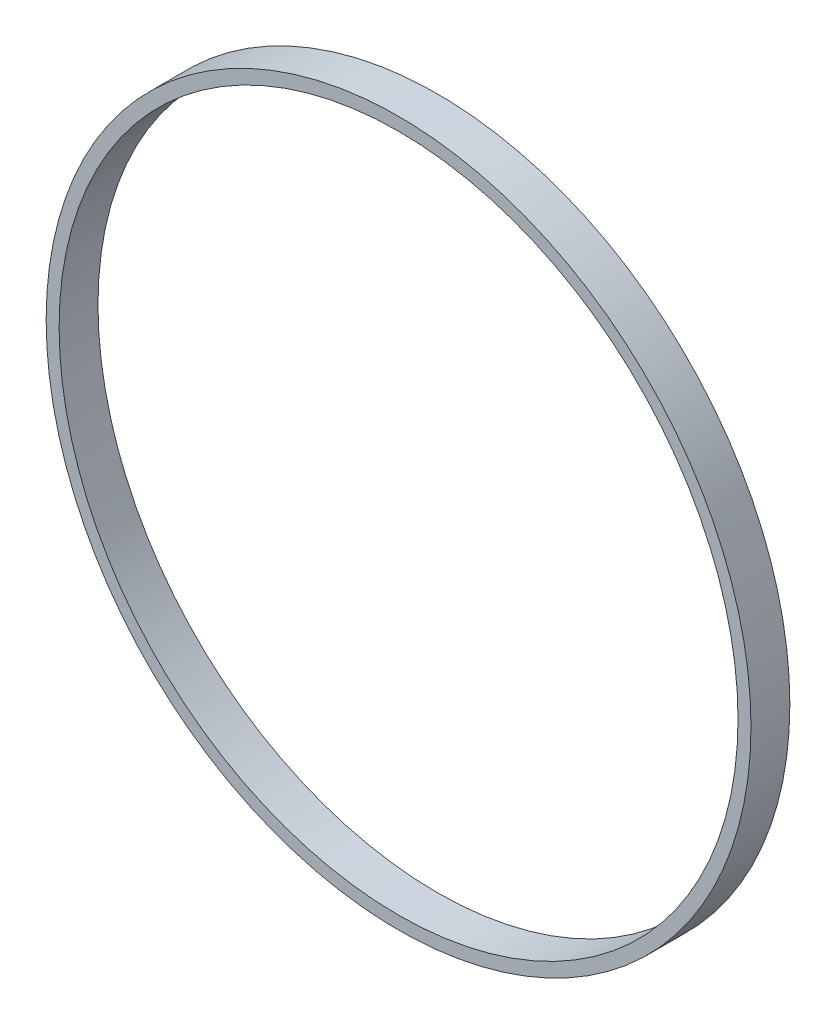
ISO-10303-21;
HEADER;
FILE_DESCRIPTION(('STEP AP214'),'2;1');
FILE_NAME('part.step','',(''),(''),'','','');
FILE_SCHEMA(('AUTOMOTIVE_DESIGN { 1 0 10303 214 1 1 1 1 }'));
ENDSEC;
DATA;
#1=APPLICATION_CONTEXT('core data for automotive mechanical design processes');
#2=APPLICATION_PROTOCOL_DEFINITION('international standard','automotive_design',2000,#1);
#3=PRODUCT_CONTEXT('',#1,'mechanical');
#4=PRODUCT('Part','Part','',(#3));
#5=PRODUCT_RELATED_PRODUCT_CATEGORY('part','',(#4));
#6=PRODUCT_DEFINITION_FORMATION('','',#4);
#7=PRODUCT_DEFINITION_CONTEXT('part definition',#1,'design');
#8=PRODUCT_DEFINITION('design','',#6,#7);
#9=PRODUCT_DEFINITION_SHAPE('','',#8);
#10=(LENGTH_UNIT() NAMED_UNIT(*) SI_UNIT(.MILLI.,.METRE.));
#11=(NAMED_UNIT(*) PLANE_ANGLE_UNIT() SI_UNIT($,.RADIAN.));
#12=(NAMED_UNIT(*) SI_UNIT($,.STERADIAN.) SOLID_ANGLE_UNIT());
#13=UNCERTAINTY_MEASURE_WITH_UNIT(LENGTH_MEASURE(1.E-05),#10,'distance_accuracy_value','');
#14=(GEOMETRIC_REPRESENTATION_CONTEXT(3) GLOBAL_UNCERTAINTY_ASSIGNED_CONTEXT((#13)) GLOBAL_UNIT_ASSIGNED_CONTEXT((#10,
#11,#12)) REPRESENTATION_CONTEXT('',''));
#15=CARTESIAN_POINT('',(0.,0.,0.));
#16=DIRECTION('',(0.,0.,1.));
#17=DIRECTION('',(1.,0.,0.));
#18=AXIS2_PLACEMENT_3D('',#15,#16,#17);
#19=CARTESIAN_POINT('',(0.,0.,9.525));
#20=DIRECTION('',(0.,0.,1.));
#21=DIRECTION('',(1.,0.,0.));
#22=AXIS2_PLACEMENT_3D('',#19,#20,#21);
#23=PLANE('',#22);
#24=CARTESIAN_POINT('',(0.,0.,9.525));
#25=DIRECTION('',(0.,0.,1.));
#26=DIRECTION('',(1.,0.,0.));
#27=AXIS2_PLACEMENT_3D('',#24,#25,#26);
#28=CIRCLE('',#27,86.36);
#29=CARTESIAN_POINT('',(-86.36,0.,9.525));
#30=VERTEX_POINT('',#29);
#31=EDGE_CURVE('E10',#30,#30,#28,.T.);
#32=ORIENTED_EDGE('',*,*,#31,.T.);
#33=EDGE_LOOP('',(#32));
#34=FACE_BOUND('',#33,.T.);
#35=CARTESIAN_POINT('',(0.,0.,9.525));
#36=DIRECTION('',(0.,0.,1.));
#37=DIRECTION('',(1.,0.,0.));
#38=AXIS2_PLACEMENT_3D('',#35,#36,#37);
#39=CIRCLE('',#38,83.185);
#40=CARTESIAN_POINT('',(-83.185,0.,9.525));
#41=VERTEX_POINT('',#40);
#42=EDGE_CURVE('E50',#41,#41,#39,.T.);
#43=ORIENTED_EDGE('',*,*,#42,.F.);
#44=EDGE_LOOP('',(#43));
#45=FACE_BOUND('',#44,.T.);
#46=ADVANCED_FACE('F37',(#34,#45),#23,.T.);
#47=CARTESIAN_POINT('',(0.,0.,0.));
#48=DIRECTION('',(0.,0.,1.));
#49=DIRECTION('',(1.,0.,0.));
#50=AXIS2_PLACEMENT_3D('',#47,#48,#49);
#51=PLANE('',#50);
#52=CARTESIAN_POINT('',(0.,0.,0.));
#53=DIRECTION('',(0.,0.,1.));
#54=DIRECTION('',(1.,0.,0.));
#55=AXIS2_PLACEMENT_3D('',#52,#53,#54);
#56=CIRCLE('',#55,86.36);
#57=CARTESIAN_POINT('',(-86.36,0.,0.));
#58=VERTEX_POINT('',#57);
#59=EDGE_CURVE('E41',#58,#58,#56,.T.);
#60=ORIENTED_EDGE('',*,*,#59,.F.);
#61=EDGE_LOOP('',(#60));
#62=FACE_BOUND('',#61,.T.);
#63=CARTESIAN_POINT('',(0.,0.,0.));
#64=DIRECTION('',(0.,0.,1.));
#65=DIRECTION('',(1.,0.,0.));
#66=AXIS2_PLACEMENT_3D('',#63,#64,#65);
#67=CIRCLE('',#66,83.185);
#68=CARTESIAN_POINT('',(-83.185,0.,0.));
#69=VERTEX_POINT('',#68);
#70=EDGE_CURVE('E52',#69,#69,#67,.T.);
#71=ORIENTED_EDGE('',*,*,#70,.T.);
#72=EDGE_LOOP('',(#71));
#73=FACE_BOUND('',#72,.T.);
#74=ADVANCED_FACE('F64',(#62,#73),#51,.F.);
#75=CARTESIAN_POINT('',(0.,0.,9.525));
#76=DIRECTION('',(0.,0.,-1.));
#77=DIRECTION('',(-1.,0.,0.));
#78=AXIS2_PLACEMENT_3D('',#75,#76,#77);
#79=CYLINDRICAL_SURFACE('',#78,86.36);
#80=CARTESIAN_POINT('',(-86.36,0.,9.525));
#81=CARTESIAN_POINT('',(-86.36,0.,9.42578125));
#82=CARTESIAN_POINT('',(-86.36,0.,9.3265625));
#83=CARTESIAN_POINT('',(-86.36,0.,9.128125));
#84=CARTESIAN_POINT('',(-86.36,0.,9.02890625));
#85=CARTESIAN_POINT('',(-86.36,0.,8.83046875));
#86=CARTESIAN_POINT('',(-86.36,0.,8.73125));
#87=CARTESIAN_POINT('',(-86.36,0.,8.5328125));
#88=CARTESIAN_POINT('',(-86.36,0.,8.43359375));
#89=CARTESIAN_POINT('',(-86.36,0.,8.23515625));
#90=CARTESIAN_POINT('',(-86.36,0.,8.1359375));
#91=CARTESIAN_POINT('',(-86.36,0.,7.9375));
#92=CARTESIAN_POINT('',(-86.36,0.,7.83828125));
#93=CARTESIAN_POINT('',(-86.36,0.,7.63984375));
#94=CARTESIAN_POINT('',(-86.36,0.,7.540625));
#95=CARTESIAN_POINT('',(-86.36,0.,7.3421875));
#96=CARTESIAN_POINT('',(-86.36,0.,7.24296875));
#97=CARTESIAN_POINT('',(-86.36,0.,7.04453125));
#98=CARTESIAN_POINT('',(-86.36,0.,6.9453125));
#99=CARTESIAN_POINT('',(-86.36,0.,6.746875));
#100=CARTESIAN_POINT('',(-86.36,0.,6.64765625));
#101=CARTESIAN_POINT('',(-86.36,0.,6.44921875));
#102=CARTESIAN_POINT('',(-86.36,0.,6.35));
#103=CARTESIAN_POINT('',(-86.36,0.,6.1515625));
#104=CARTESIAN_POINT('',(-86.36,0.,6.05234375));
#105=CARTESIAN_POINT('',(-86.36,0.,5.85390625));
#106=CARTESIAN_POINT('',(-86.36,0.,5.7546875));
#107=CARTESIAN_POINT('',(-86.36,0.,5.55625));
#108=CARTESIAN_POINT('',(-86.36,0.,5.45703125));
#109=CARTESIAN_POINT('',(-86.36,0.,5.25859375));
#110=CARTESIAN_POINT('',(-86.36,0.,5.159375));
#111=CARTESIAN_POINT('',(-86.36,0.,4.9609375));
#112=CARTESIAN_POINT('',(-86.36,0.,4.86171875));
#113=CARTESIAN_POINT('',(-86.36,0.,4.66328125));
#114=CARTESIAN_POINT('',(-86.36,0.,4.5640625));
#115=CARTESIAN_POINT('',(-86.36,0.,4.365625));
#116=CARTESIAN_POINT('',(-86.36,0.,4.26640625));
#117=CARTESIAN_POINT('',(-86.36,0.,4.06796875));
#118=CARTESIAN_POINT('',(-86.36,0.,3.96875));
#119=CARTESIAN_POINT('',(-86.36,0.,3.7703125));
#120=CARTESIAN_POINT('',(-86.36,0.,3.67109375));
#121=CARTESIAN_POINT('',(-86.36,0.,3.47265625));
#122=CARTESIAN_POINT('',(-86.36,0.,3.3734375));
#123=CARTESIAN_POINT('',(-86.36,0.,3.175));
#124=CARTESIAN_POINT('',(-86.36,0.,3.07578125));
#125=CARTESIAN_POINT('',(-86.36,0.,2.87734375));
#126=CARTESIAN_POINT('',(-86.36,0.,2.778125));
#127=CARTESIAN_POINT('',(-86.36,0.,2.5796875));
#128=CARTESIAN_POINT('',(-86.36,0.,2.48046875));
#129=CARTESIAN_POINT('',(-86.36,0.,2.28203125));
#130=CARTESIAN_POINT('',(-86.36,0.,2.1828125));
#131=CARTESIAN_POINT('',(-86.36,0.,1.984375));
#132=CARTESIAN_POINT('',(-86.36,0.,1.88515625));
#133=CARTESIAN_POINT('',(-86.36,0.,1.68671875));
#134=CARTESIAN_POINT('',(-86.36,0.,1.5875));
#135=CARTESIAN_POINT('',(-86.36,0.,1.3890625));
#136=CARTESIAN_POINT('',(-86.36,0.,1.28984375));
#137=CARTESIAN_POINT('',(-86.36,0.,1.09140625));
#138=CARTESIAN_POINT('',(-86.36,0.,0.992187500000001));
#139=CARTESIAN_POINT('',(-86.36,0.,0.793750000000001));
#140=CARTESIAN_POINT('',(-86.36,0.,0.69453125));
#141=CARTESIAN_POINT('',(-86.36,0.,0.49609375));
#142=CARTESIAN_POINT('',(-86.36,0.,0.396875));
#143=CARTESIAN_POINT('',(-86.36,0.,0.1984375));
#144=CARTESIAN_POINT('',(-86.36,0.,0.0992187500000001));
#145=CARTESIAN_POINT('',(-86.36,0.,0.));
#146=B_SPLINE_CURVE_WITH_KNOTS('',3,(#80,#81,#82,#83,#84,#85,#86,#87,#88,#89,#90,#91,#92,#93,
#94,#95,#96,#97,#98,#99,#100,#101,#102,#103,#104,#105,#106,#107,#108,#109,#110,#111,#112,#113,
#114,#115,#116,#117,#118,#119,#120,#121,#122,#123,#124,#125,#126,#127,#128,#129,#130,#131,#132,
#133,#134,#135,#136,#137,#138,#139,#140,#141,#142,#143,#144,#145),.UNSPECIFIED.,.F.,.F.,(4,2,2,
2,2,2,2,2,2,2,2,2,2,2,2,2,2,2,2,2,2,2,2,2,2,2,2,2,2,2,2,2,4),(0.,0.297656249999998,
0.595312499999999,0.892968749999999,1.190625,1.48828125,1.7859375,2.08359375,2.38125,2.67890625,
2.9765625,3.27421875,3.571875,3.86953125,4.1671875,4.46484375,4.7625,5.06015625,5.3578125,
5.65546875,5.953125,6.25078125,6.5484375,6.84609375,7.14375,7.44140625,7.7390625,8.03671875,
8.334375,8.63203125,8.9296875,9.22734375,9.525),.UNSPECIFIED.);
#147=EDGE_CURVE('BSEAM39',#30,#58,#146,.T.);
#148=ORIENTED_EDGE('',*,*,#31,.F.);
#149=ORIENTED_EDGE('',*,*,#59,.T.);
#150=ORIENTED_EDGE('',*,*,#147,.T.);
#151=ORIENTED_EDGE('',*,*,#147,.F.);
#152=EDGE_LOOP('',(#148,#150,#149,#151));
#153=FACE_BOUND('',#152,.T.);
#154=ADVANCED_FACE('F39',(#153),#79,.T.);
#155=CARTESIAN_POINT('',(0.,0.,9.525));
#156=DIRECTION('',(0.,0.,-1.));
#157=DIRECTION('',(-1.,0.,0.));
#158=AXIS2_PLACEMENT_3D('',#155,#156,#157);
#159=CYLINDRICAL_SURFACE('',#158,83.185);
#160=CARTESIAN_POINT('',(-83.185,0.,9.525));
#161=CARTESIAN_POINT('',(-83.185,0.,9.42578125));
#162=CARTESIAN_POINT('',(-83.185,0.,9.3265625));
#163=CARTESIAN_POINT('',(-83.185,0.,9.128125));
#164=CARTESIAN_POINT('',(-83.185,0.,9.02890625));
#165=CARTESIAN_POINT('',(-83.185,0.,8.83046875));
#166=CARTESIAN_POINT('',(-83.185,0.,8.73125));
#167=CARTESIAN_POINT('',(-83.185,0.,8.5328125));
#168=CARTESIAN_POINT('',(-83.185,0.,8.43359375));
#169=CARTESIAN_POINT('',(-83.185,0.,8.23515625));
#170=CARTESIAN_POINT('',(-83.185,0.,8.1359375));
#171=CARTESIAN_POINT('',(-83.185,0.,7.9375));
#172=CARTESIAN_POINT('',(-83.185,0.,7.83828125));
#173=CARTESIAN_POINT('',(-83.185,0.,7.63984375));
#174=CARTESIAN_POINT('',(-83.185,0.,7.540625));
#175=CARTESIAN_POINT('',(-83.185,0.,7.3421875));
#176=CARTESIAN_POINT('',(-83.185,0.,7.24296875));
#177=CARTESIAN_POINT('',(-83.185,0.,7.04453125));
#178=CARTESIAN_POINT('',(-83.185,0.,6.9453125));
#179=CARTESIAN_POINT('',(-83.185,0.,6.746875));
#180=CARTESIAN_POINT('',(-83.185,0.,6.64765625));
#181=CARTESIAN_POINT('',(-83.185,0.,6.44921875));
#182=CARTESIAN_POINT('',(-83.185,0.,6.35));
#183=CARTESIAN_POINT('',(-83.185,0.,6.1515625));
#184=CARTESIAN_POINT('',(-83.185,0.,6.05234375));
#185=CARTESIAN_POINT('',(-83.185,0.,5.85390625));
#186=CARTESIAN_POINT('',(-83.185,0.,5.7546875));
#187=CARTESIAN_POINT('',(-83.185,0.,5.55625));
#188=CARTESIAN_POINT('',(-83.185,0.,5.45703125));
#189=CARTESIAN_POINT('',(-83.185,0.,5.25859375));
#190=CARTESIAN_POINT('',(-83.185,0.,5.159375));
#191=CARTESIAN_POINT('',(-83.185,0.,4.9609375));
#192=CARTESIAN_POINT('',(-83.185,0.,4.86171875));
#193=CARTESIAN_POINT('',(-83.185,0.,4.66328125));
#194=CARTESIAN_POINT('',(-83.185,0.,4.5640625));
#195=CARTESIAN_POINT('',(-83.185,0.,4.365625));
#196=CARTESIAN_POINT('',(-83.185,0.,4.26640625));
#197=CARTESIAN_POINT('',(-83.185,0.,4.06796875));
#198=CARTESIAN_POINT('',(-83.185,0.,3.96875));
#199=CARTESIAN_POINT('',(-83.185,0.,3.7703125));
#200=CARTESIAN_POINT('',(-83.185,0.,3.67109375));
#201=CARTESIAN_POINT('',(-83.185,0.,3.47265625));
#202=CARTESIAN_POINT('',(-83.185,0.,3.3734375));
#203=CARTESIAN_POINT('',(-83.185,0.,3.175));
#204=CARTESIAN_POINT('',(-83.185,0.,3.07578125));
#205=CARTESIAN_POINT('',(-83.185,0.,2.87734375));
#206=CARTESIAN_POINT('',(-83.185,0.,2.778125));
#207=CARTESIAN_POINT('',(-83.185,0.,2.5796875));
#208=CARTESIAN_POINT('',(-83.185,0.,2.48046875));
#209=CARTESIAN_POINT('',(-83.185,0.,2.28203125));
#210=CARTESIAN_POINT('',(-83.185,0.,2.1828125));
#211=CARTESIAN_POINT('',(-83.185,0.,1.984375));
#212=CARTESIAN_POINT('',(-83.185,0.,1.88515625));
#213=CARTESIAN_POINT('',(-83.185,0.,1.68671875));
#214=CARTESIAN_POINT('',(-83.185,0.,1.5875));
#215=CARTESIAN_POINT('',(-83.185,0.,1.3890625));
#216=CARTESIAN_POINT('',(-83.185,0.,1.28984375));
#217=CARTESIAN_POINT('',(-83.185,0.,1.09140625));
#218=CARTESIAN_POINT('',(-83.185,0.,0.992187500000001));
#219=CARTESIAN_POINT('',(-83.185,0.,0.793750000000001));
#220=CARTESIAN_POINT('',(-83.185,0.,0.69453125));
#221=CARTESIAN_POINT('',(-83.185,0.,0.49609375));
#222=CARTESIAN_POINT('',(-83.185,0.,0.396875));
#223=CARTESIAN_POINT('',(-83.185,0.,0.1984375));
#224=CARTESIAN_POINT('',(-83.185,0.,0.0992187500000001));
#225=CARTESIAN_POINT('',(-83.185,0.,0.));
#226=B_SPLINE_CURVE_WITH_KNOTS('',3,(#160,#161,#162,#163,#164,#165,#166,#167,#168,#169,#170,
#171,#172,#173,#174,#175,#176,#177,#178,#179,#180,#181,#182,#183,#184,#185,#186,#187,#188,#189,
#190,#191,#192,#193,#194,#195,#196,#197,#198,#199,#200,#201,#202,#203,#204,#205,#206,#207,#208,
#209,#210,#211,#212,#213,#214,#215,#216,#217,#218,#219,#220,#221,#222,#223,#224,#225),
.UNSPECIFIED.,.F.,.F.,(4,2,2,2,2,2,2,2,2,2,2,2,2,2,2,2,2,2,2,2,2,2,2,2,2,2,2,2,2,2,2,2,4),(0.,
0.29765625,0.5953125,0.892968750000001,1.190625,1.48828125,1.7859375,2.08359375,2.38125,
2.67890625,2.9765625,3.27421875,3.571875,3.86953125,4.1671875,4.46484375,4.7625,5.06015625,
5.3578125,5.65546875,5.953125,6.25078125,6.5484375,6.84609375,7.14375,7.44140625,7.7390625,
8.03671875,8.334375,8.63203125,8.9296875,9.22734375,9.525),.UNSPECIFIED.);
#227=EDGE_CURVE('BSEAM60',#41,#69,#226,.T.);
#228=ORIENTED_EDGE('',*,*,#42,.T.);
#229=ORIENTED_EDGE('',*,*,#70,.F.);
#230=ORIENTED_EDGE('',*,*,#227,.T.);
#231=ORIENTED_EDGE('',*,*,#227,.F.);
#232=EDGE_LOOP('',(#228,#230,#229,#231));
#233=FACE_BOUND('',#232,.T.);
#234=ADVANCED_FACE('F60',(#233),#159,.F.);
#235=CLOSED_SHELL('',(#46,#74,#154,#234));
#236=MANIFOLD_SOLID_BREP('B2',#235);
#237=ADVANCED_BREP_SHAPE_REPRESENTATION('',(#18,#236),#14);
#238=SHAPE_DEFINITION_REPRESENTATION(#9,#237);
ENDSEC;
END-ISO-10303-21;
